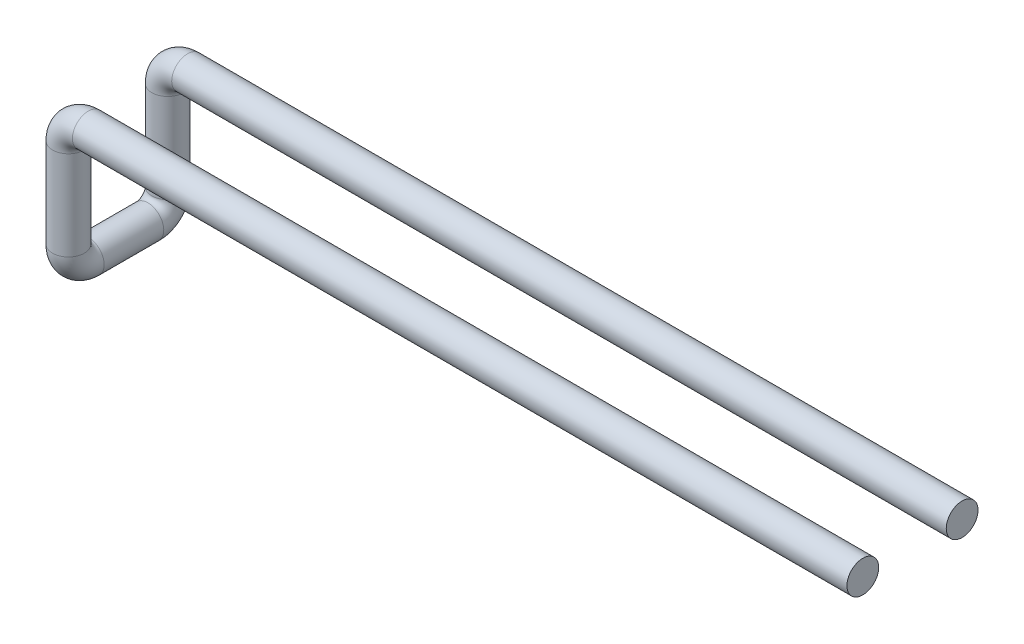
ISO-10303-21;
HEADER;
FILE_DESCRIPTION(('STEP AP214'),'2;1');
FILE_NAME('part.step','',(''),(''),'','','');
FILE_SCHEMA(('AUTOMOTIVE_DESIGN { 1 0 10303 214 1 1 1 1 }'));
ENDSEC;
DATA;
#1=APPLICATION_CONTEXT('core data for automotive mechanical design processes');
#2=APPLICATION_PROTOCOL_DEFINITION('international standard','automotive_design',2000,#1);
#3=PRODUCT_CONTEXT('',#1,'mechanical');
#4=PRODUCT('Part','Part','',(#3));
#5=PRODUCT_RELATED_PRODUCT_CATEGORY('part','',(#4));
#6=PRODUCT_DEFINITION_FORMATION('','',#4);
#7=PRODUCT_DEFINITION_CONTEXT('part definition',#1,'design');
#8=PRODUCT_DEFINITION('design','',#6,#7);
#9=PRODUCT_DEFINITION_SHAPE('','',#8);
#10=(LENGTH_UNIT() NAMED_UNIT(*) SI_UNIT(.MILLI.,.METRE.));
#11=(NAMED_UNIT(*) PLANE_ANGLE_UNIT() SI_UNIT($,.RADIAN.));
#12=(NAMED_UNIT(*) SI_UNIT($,.STERADIAN.) SOLID_ANGLE_UNIT());
#13=UNCERTAINTY_MEASURE_WITH_UNIT(LENGTH_MEASURE(1.E-05),#10,'distance_accuracy_value','');
#14=(GEOMETRIC_REPRESENTATION_CONTEXT(3) GLOBAL_UNCERTAINTY_ASSIGNED_CONTEXT((#13)) GLOBAL_UNIT_ASSIGNED_CONTEXT((#10,
#11,#12)) REPRESENTATION_CONTEXT('',''));
#15=CARTESIAN_POINT('',(0.,0.,0.));
#16=DIRECTION('',(0.,0.,1.));
#17=DIRECTION('',(1.,0.,0.));
#18=AXIS2_PLACEMENT_3D('',#15,#16,#17);
#19=CARTESIAN_POINT('',(0.,0.,0.));
#20=DIRECTION('',(0.999999999999998,0.,0.));
#21=DIRECTION('',(0.,0.999999999999999,0.));
#22=AXIS2_PLACEMENT_3D('',#19,#20,#21);
#23=PLANE('',#22);
#24=CARTESIAN_POINT('',(0.,0.,0.));
#25=DIRECTION('',(0.999999999999998,0.,0.));
#26=DIRECTION('',(0.,0.999999999999999,0.));
#27=AXIS2_PLACEMENT_3D('',#24,#25,#26);
#28=CIRCLE('',#27,0.400000000000001);
#29=CARTESIAN_POINT('',(0.,0.399999999999996,0.));
#30=VERTEX_POINT('',#29);
#31=EDGE_CURVE('E84',#30,#30,#28,.T.);
#32=ORIENTED_EDGE('',*,*,#31,.T.);
#33=EDGE_LOOP('',(#32));
#34=FACE_BOUND('',#33,.T.);
#35=ADVANCED_FACE('F72',(#34),#23,.T.);
#36=CARTESIAN_POINT('',(0.,0.,0.));
#37=DIRECTION('',(-0.999999999999998,0.,0.));
#38=DIRECTION('',(0.,0.,1.));
#39=AXIS2_PLACEMENT_3D('',#36,#37,#38);
#40=CYLINDRICAL_SURFACE('',#39,0.400000000000001);
#41=CARTESIAN_POINT('',(-19.5,0.,0.));
#42=DIRECTION('',(0.999999999999998,0.,0.));
#43=DIRECTION('',(0.,0.999999999999999,0.));
#44=AXIS2_PLACEMENT_3D('',#41,#42,#43);
#45=CIRCLE('',#44,0.400000000000001);
#46=CARTESIAN_POINT('',(-19.5,0.399999999999975,0.));
#47=VERTEX_POINT('',#46);
#48=EDGE_CURVE('E106',#47,#47,#45,.T.);
#49=ORIENTED_EDGE('',*,*,#48,.T.);
#50=EDGE_LOOP('',(#49));
#51=FACE_BOUND('',#50,.T.);
#52=ORIENTED_EDGE('',*,*,#31,.F.);
#53=EDGE_LOOP('',(#52));
#54=FACE_BOUND('',#53,.T.);
#55=ADVANCED_FACE('F133',(#51,#54),#40,.T.);
#56=CARTESIAN_POINT('',(-19.5,-0.500000000000026,0.));
#57=DIRECTION('',(0.,0.,1.));
#58=DIRECTION('',(0.999999999999998,0.,0.));
#59=AXIS2_PLACEMENT_3D('',#56,#57,#58);
#60=TOROIDAL_SURFACE('',#59,0.5,0.400000000000001);
#61=CARTESIAN_POINT('',(-20.,-0.500000000000009,0.));
#62=DIRECTION('',(0.,0.999999999999999,0.));
#63=DIRECTION('',(-0.999999999999999,0.,0.));
#64=AXIS2_PLACEMENT_3D('',#61,#62,#63);
#65=CIRCLE('',#64,0.400000000000001);
#66=CARTESIAN_POINT('',(-20.4,-0.499999999999995,0.));
#67=VERTEX_POINT('',#66);
#68=EDGE_CURVE('E109',#67,#67,#65,.T.);
#69=CARTESIAN_POINT('',(-19.5,-0.500000000000026,0.));
#70=DIRECTION('',(0.,0.,1.));
#71=DIRECTION('',(0.999999999999998,0.,0.));
#72=AXIS2_PLACEMENT_3D('',#69,#70,#71);
#73=CIRCLE('',#72,0.900000000000001);
#74=EDGE_CURVE('',#47,#67,#73,.T.);
#75=ORIENTED_EDGE('',*,*,#48,.F.);
#76=ORIENTED_EDGE('',*,*,#68,.T.);
#77=ORIENTED_EDGE('',*,*,#74,.T.);
#78=ORIENTED_EDGE('',*,*,#74,.F.);
#79=EDGE_LOOP('',(#75,#77,#76,#78));
#80=FACE_BOUND('',#79,.T.);
#81=ADVANCED_FACE('F128',(#80),#60,.T.);
#82=CARTESIAN_POINT('',(-20.,-0.500000000000009,0.));
#83=DIRECTION('',(0.,-0.999999999999999,0.));
#84=DIRECTION('',(0.,0.,-1.));
#85=AXIS2_PLACEMENT_3D('',#82,#83,#84);
#86=CYLINDRICAL_SURFACE('',#85,0.400000000000001);
#87=CARTESIAN_POINT('',(-20.,-2.75000000000002,0.));
#88=DIRECTION('',(0.,0.999999999999999,0.));
#89=DIRECTION('',(-0.999999999999998,0.,0.));
#90=AXIS2_PLACEMENT_3D('',#87,#88,#89);
#91=CIRCLE('',#90,0.400000000000001);
#92=CARTESIAN_POINT('',(-20.,-2.75000000000002,-0.400000000000028));
#93=VERTEX_POINT('',#92);
#94=EDGE_CURVE('E79',#93,#93,#91,.T.);
#95=ORIENTED_EDGE('',*,*,#94,.T.);
#96=EDGE_LOOP('',(#95));
#97=FACE_BOUND('',#96,.T.);
#98=ORIENTED_EDGE('',*,*,#68,.F.);
#99=EDGE_LOOP('',(#98));
#100=FACE_BOUND('',#99,.T.);
#101=ADVANCED_FACE('F114',(#97,#100),#86,.T.);
#102=CARTESIAN_POINT('',(-20.,-2.75000000000002,0.499999999999973));
#103=DIRECTION('',(-0.999999999999998,0.,0.));
#104=DIRECTION('',(0.,0.,1.));
#105=AXIS2_PLACEMENT_3D('',#102,#103,#104);
#106=TOROIDAL_SURFACE('',#105,0.5,0.400000000000001);
#107=CARTESIAN_POINT('',(-20.,-3.25000000000002,0.50000000000007));
#108=DIRECTION('',(0.,0.,-1.));
#109=DIRECTION('',(-0.999999999999999,0.,0.));
#110=AXIS2_PLACEMENT_3D('',#107,#108,#109);
#111=CIRCLE('',#110,0.400000000000001);
#112=CARTESIAN_POINT('',(-19.9999999999999,-3.65000000000002,0.500000000000148));
#113=VERTEX_POINT('',#112);
#114=EDGE_CURVE('E14',#113,#113,#111,.T.);
#115=CARTESIAN_POINT('',(-20.,-2.75000000000002,0.499999999999973));
#116=DIRECTION('',(-0.999999999999998,0.,0.));
#117=DIRECTION('',(0.,0.,1.));
#118=AXIS2_PLACEMENT_3D('',#115,#116,#117);
#119=CIRCLE('',#118,0.900000000000001);
#120=EDGE_CURVE('',#93,#113,#119,.T.);
#121=ORIENTED_EDGE('',*,*,#94,.F.);
#122=ORIENTED_EDGE('',*,*,#114,.T.);
#123=ORIENTED_EDGE('',*,*,#120,.T.);
#124=ORIENTED_EDGE('',*,*,#120,.F.);
#125=EDGE_LOOP('',(#121,#123,#122,#124));
#126=FACE_BOUND('',#125,.T.);
#127=ADVANCED_FACE('F117',(#126),#106,.T.);
#128=CARTESIAN_POINT('',(-20.,-3.25,0.499999999999959));
#129=DIRECTION('',(0.,0.,0.999999999999999));
#130=DIRECTION('',(0.999999999999998,0.,0.));
#131=AXIS2_PLACEMENT_3D('',#128,#129,#130);
#132=CYLINDRICAL_SURFACE('',#131,0.400000000000001);
#133=ORIENTED_EDGE('',*,*,#114,.F.);
#134=EDGE_LOOP('',(#133));
#135=FACE_BOUND('',#134,.T.);
#136=CARTESIAN_POINT('',(-20.,-3.25,1.99999999999988));
#137=DIRECTION('',(0.,0.,-1.));
#138=DIRECTION('',(-0.999999999999999,0.,0.));
#139=AXIS2_PLACEMENT_3D('',#136,#137,#138);
#140=CIRCLE('',#139,0.400000000000001);
#141=CARTESIAN_POINT('',(-20.,-3.65,1.99999999999981));
#142=VERTEX_POINT('',#141);
#143=EDGE_CURVE('E102',#142,#142,#140,.F.);
#144=ORIENTED_EDGE('',*,*,#143,.F.);
#145=EDGE_LOOP('',(#144));
#146=FACE_BOUND('',#145,.T.);
#147=ADVANCED_FACE('F119',(#135,#146),#132,.T.);
#148=CARTESIAN_POINT('',(0.,0.,2.49999999999942));
#149=DIRECTION('',(0.999999999999999,0.,0.));
#150=DIRECTION('',(0.,0.999999999999999,0.));
#151=AXIS2_PLACEMENT_3D('',#148,#149,#150);
#152=PLANE('',#151);
#153=CARTESIAN_POINT('',(0.,0.,2.49999999999942));
#154=DIRECTION('',(-0.999999999999999,0.,0.));
#155=DIRECTION('',(0.,0.999999999999999,0.));
#156=AXIS2_PLACEMENT_3D('',#153,#154,#155);
#157=CIRCLE('',#156,0.400000000000001);
#158=CARTESIAN_POINT('',(0.,0.400000000000011,2.49999999999938));
#159=VERTEX_POINT('',#158);
#160=EDGE_CURVE('E88',#159,#159,#157,.F.);
#161=ORIENTED_EDGE('',*,*,#160,.T.);
#162=EDGE_LOOP('',(#161));
#163=FACE_BOUND('',#162,.T.);
#164=ADVANCED_FACE('F126',(#163),#152,.T.);
#165=CARTESIAN_POINT('',(0.,0.,2.49999999999942));
#166=DIRECTION('',(-0.999999999999999,0.,0.));
#167=DIRECTION('',(0.,0.,0.999999999999999));
#168=AXIS2_PLACEMENT_3D('',#165,#166,#167);
#169=CYLINDRICAL_SURFACE('',#168,0.400000000000001);
#170=CARTESIAN_POINT('',(-19.4999999999999,0.,2.49999999999997));
#171=DIRECTION('',(-0.999999999999999,0.,0.));
#172=DIRECTION('',(0.,0.999999999999999,0.));
#173=AXIS2_PLACEMENT_3D('',#170,#171,#172);
#174=CIRCLE('',#173,0.400000000000001);
#175=CARTESIAN_POINT('',(-19.4999999999999,0.399999999999971,2.49999999999997));
#176=VERTEX_POINT('',#175);
#177=EDGE_CURVE('E91',#176,#176,#174,.F.);
#178=ORIENTED_EDGE('',*,*,#177,.T.);
#179=EDGE_LOOP('',(#178));
#180=FACE_BOUND('',#179,.T.);
#181=ORIENTED_EDGE('',*,*,#160,.F.);
#182=EDGE_LOOP('',(#181));
#183=FACE_BOUND('',#182,.T.);
#184=ADVANCED_FACE('F89',(#180,#183),#169,.T.);
#185=CARTESIAN_POINT('',(-19.5,-0.50000000000003,2.49999999999997));
#186=DIRECTION('',(0.,0.,0.999999999999999));
#187=DIRECTION('',(0.999999999999999,0.,0.));
#188=AXIS2_PLACEMENT_3D('',#185,#186,#187);
#189=TOROIDAL_SURFACE('',#188,0.5,0.400000000000001);
#190=CARTESIAN_POINT('',(-20.,-0.50000000000002,2.49999999999994));
#191=DIRECTION('',(0.,-0.999999999999999,0.));
#192=DIRECTION('',(-0.999999999999998,0.,0.));
#193=AXIS2_PLACEMENT_3D('',#190,#191,#192);
#194=CIRCLE('',#193,0.400000000000001);
#195=CARTESIAN_POINT('',(-20.4,-0.500000000000011,2.49999999999992));
#196=VERTEX_POINT('',#195);
#197=EDGE_CURVE('E94',#196,#196,#194,.F.);
#198=CARTESIAN_POINT('',(-19.5,-0.50000000000003,2.49999999999997));
#199=DIRECTION('',(0.,0.,0.999999999999999));
#200=DIRECTION('',(0.999999999999999,0.,0.));
#201=AXIS2_PLACEMENT_3D('',#198,#199,#200);
#202=CIRCLE('',#201,0.900000000000001);
#203=EDGE_CURVE('',#176,#196,#202,.T.);
#204=ORIENTED_EDGE('',*,*,#177,.F.);
#205=ORIENTED_EDGE('',*,*,#197,.T.);
#206=ORIENTED_EDGE('',*,*,#203,.T.);
#207=ORIENTED_EDGE('',*,*,#203,.F.);
#208=EDGE_LOOP('',(#204,#206,#205,#207));
#209=FACE_BOUND('',#208,.T.);
#210=ADVANCED_FACE('F147',(#209),#189,.T.);
#211=CARTESIAN_POINT('',(-20.,-0.50000000000002,2.49999999999994));
#212=DIRECTION('',(0.,-0.999999999999999,0.));
#213=DIRECTION('',(0.,0.,-1.));
#214=AXIS2_PLACEMENT_3D('',#211,#212,#213);
#215=CYLINDRICAL_SURFACE('',#214,0.400000000000001);
#216=CARTESIAN_POINT('',(-19.9999999999999,-2.74999999999999,2.49999999999997));
#217=DIRECTION('',(0.,-0.999999999999999,0.));
#218=DIRECTION('',(-0.999999999999999,0.,0.));
#219=AXIS2_PLACEMENT_3D('',#216,#217,#218);
#220=CIRCLE('',#219,0.400000000000001);
#221=CARTESIAN_POINT('',(-19.9999999999999,-2.74999999999999,2.89999999999998));
#222=VERTEX_POINT('',#221);
#223=EDGE_CURVE('E99',#222,#222,#220,.F.);
#224=ORIENTED_EDGE('',*,*,#223,.T.);
#225=EDGE_LOOP('',(#224));
#226=FACE_BOUND('',#225,.T.);
#227=ORIENTED_EDGE('',*,*,#197,.F.);
#228=EDGE_LOOP('',(#227));
#229=FACE_BOUND('',#228,.T.);
#230=ADVANCED_FACE('F143',(#226,#229),#215,.T.);
#231=CARTESIAN_POINT('',(-20.,-2.75,1.99999999999997));
#232=DIRECTION('',(0.999999999999999,0.,0.));
#233=DIRECTION('',(0.,0.,-0.999999999999999));
#234=AXIS2_PLACEMENT_3D('',#231,#232,#233);
#235=TOROIDAL_SURFACE('',#234,0.5,0.400000000000001);
#236=CARTESIAN_POINT('',(-20.,-2.75,1.99999999999997));
#237=DIRECTION('',(0.999999999999999,0.,0.));
#238=DIRECTION('',(0.,0.,-0.999999999999999));
#239=AXIS2_PLACEMENT_3D('',#236,#237,#238);
#240=CIRCLE('',#239,0.900000000000001);
#241=EDGE_CURVE('',#222,#142,#240,.T.);
#242=ORIENTED_EDGE('',*,*,#223,.F.);
#243=ORIENTED_EDGE('',*,*,#143,.T.);
#244=ORIENTED_EDGE('',*,*,#241,.T.);
#245=ORIENTED_EDGE('',*,*,#241,.F.);
#246=EDGE_LOOP('',(#242,#244,#243,#245));
#247=FACE_BOUND('',#246,.T.);
#248=ADVANCED_FACE('F140',(#247),#235,.T.);
#249=CLOSED_SHELL('',(#35,#55,#81,#101,#127,#147,#164,#184,#210,#230,#248));
#250=MANIFOLD_SOLID_BREP('B2',#249);
#251=ADVANCED_BREP_SHAPE_REPRESENTATION('',(#18,#250),#14);
#252=SHAPE_DEFINITION_REPRESENTATION(#9,#251);
ENDSEC;
END-ISO-10303-21;
